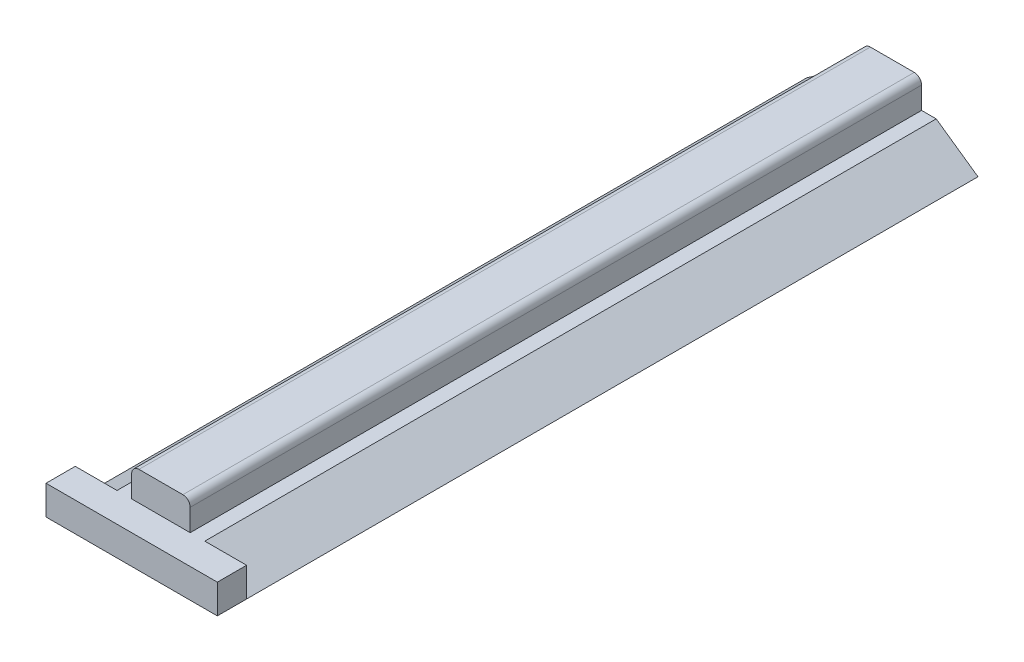
ISO-10303-21;
HEADER;
FILE_DESCRIPTION(('STEP AP214'),'2;1');
FILE_NAME('part.step','',(''),(''),'','','');
FILE_SCHEMA(('AUTOMOTIVE_DESIGN { 1 0 10303 214 1 1 1 1 }'));
ENDSEC;
DATA;
#1=APPLICATION_CONTEXT('core data for automotive mechanical design processes');
#2=APPLICATION_PROTOCOL_DEFINITION('international standard','automotive_design',2000,#1);
#3=PRODUCT_CONTEXT('',#1,'mechanical');
#4=PRODUCT('Part','Part','',(#3));
#5=PRODUCT_RELATED_PRODUCT_CATEGORY('part','',(#4));
#6=PRODUCT_DEFINITION_FORMATION('','',#4);
#7=PRODUCT_DEFINITION_CONTEXT('part definition',#1,'design');
#8=PRODUCT_DEFINITION('design','',#6,#7);
#9=PRODUCT_DEFINITION_SHAPE('','',#8);
#10=(LENGTH_UNIT() NAMED_UNIT(*) SI_UNIT(.MILLI.,.METRE.));
#11=(NAMED_UNIT(*) PLANE_ANGLE_UNIT() SI_UNIT($,.RADIAN.));
#12=(NAMED_UNIT(*) SI_UNIT($,.STERADIAN.) SOLID_ANGLE_UNIT());
#13=UNCERTAINTY_MEASURE_WITH_UNIT(LENGTH_MEASURE(1.E-05),#10,'distance_accuracy_value','');
#14=(GEOMETRIC_REPRESENTATION_CONTEXT(3) GLOBAL_UNCERTAINTY_ASSIGNED_CONTEXT((#13)) GLOBAL_UNIT_ASSIGNED_CONTEXT((#10,
#11,#12)) REPRESENTATION_CONTEXT('',''));
#15=CARTESIAN_POINT('',(0.,0.,0.));
#16=DIRECTION('',(0.,0.,1.));
#17=DIRECTION('',(1.,0.,0.));
#18=AXIS2_PLACEMENT_3D('',#15,#16,#17);
#19=CARTESIAN_POINT('',(3.,0.,25.));
#20=DIRECTION('',(0.,-1.,0.));
#21=DIRECTION('',(1.,0.,0.));
#22=AXIS2_PLACEMENT_3D('',#19,#20,#21);
#23=PLANE('',#22);
#24=DIRECTION('',(0.,0.,1.));
#25=VECTOR('',#24,1.);
#26=CARTESIAN_POINT('',(0.499999999999998,0.,0.));
#27=LINE('',#26,#25);
#28=CARTESIAN_POINT('',(0.5,0.,0.));
#29=VERTEX_POINT('',#28);
#30=CARTESIAN_POINT('',(0.500000000000001,0.,25.));
#31=VERTEX_POINT('',#30);
#32=EDGE_CURVE('E156',#29,#31,#27,.T.);
#33=ORIENTED_EDGE('',*,*,#32,.F.);
#34=DIRECTION('',(-1.,0.,0.));
#35=VECTOR('',#34,1.);
#36=CARTESIAN_POINT('',(3.,0.,0.));
#37=LINE('',#36,#35);
#38=CARTESIAN_POINT('',(0.,0.,0.));
#39=VERTEX_POINT('',#38);
#40=EDGE_CURVE('E211',#29,#39,#37,.T.);
#41=ORIENTED_EDGE('',*,*,#40,.T.);
#42=DIRECTION('',(0.,0.,-1.));
#43=VECTOR('',#42,1.);
#44=CARTESIAN_POINT('',(0.,0.,25.));
#45=LINE('',#44,#43);
#46=CARTESIAN_POINT('',(0.,0.,25.));
#47=VERTEX_POINT('',#46);
#48=EDGE_CURVE('E242',#47,#39,#45,.T.);
#49=ORIENTED_EDGE('',*,*,#48,.F.);
#50=DIRECTION('',(-1.,0.,0.));
#51=VECTOR('',#50,1.);
#52=CARTESIAN_POINT('',(-1.42814800674213,0.,25.));
#53=LINE('',#52,#51);
#54=CARTESIAN_POINT('',(-1.42814800674213,0.,25.));
#55=VERTEX_POINT('',#54);
#56=EDGE_CURVE('E192',#47,#55,#53,.T.);
#57=ORIENTED_EDGE('',*,*,#56,.T.);
#58=DIRECTION('',(0.,0.,-1.));
#59=VECTOR('',#58,1.);
#60=CARTESIAN_POINT('',(-1.42814800674213,0.,26.));
#61=LINE('',#60,#59);
#62=CARTESIAN_POINT('',(-1.42814800674213,0.,26.));
#63=VERTEX_POINT('',#62);
#64=EDGE_CURVE('E185',#63,#55,#61,.T.);
#65=ORIENTED_EDGE('',*,*,#64,.F.);
#66=DIRECTION('',(-1.,0.,0.));
#67=VECTOR('',#66,1.);
#68=CARTESIAN_POINT('',(-1.42814800674213,0.,26.));
#69=LINE('',#68,#67);
#70=CARTESIAN_POINT('',(4.42814800674213,0.,26.));
#71=VERTEX_POINT('',#70);
#72=EDGE_CURVE('E182',#71,#63,#69,.T.);
#73=ORIENTED_EDGE('',*,*,#72,.F.);
#74=DIRECTION('',(0.,0.,-1.));
#75=VECTOR('',#74,1.);
#76=CARTESIAN_POINT('',(4.42814800674213,0.,26.));
#77=LINE('',#76,#75);
#78=CARTESIAN_POINT('',(4.42814800674213,0.,25.));
#79=VERTEX_POINT('',#78);
#80=EDGE_CURVE('E199',#71,#79,#77,.T.);
#81=ORIENTED_EDGE('',*,*,#80,.T.);
#82=CARTESIAN_POINT('',(3.,0.,25.));
#83=VERTEX_POINT('',#82);
#84=EDGE_CURVE('E176',#79,#83,#53,.T.);
#85=ORIENTED_EDGE('',*,*,#84,.T.);
#86=DIRECTION('',(0.,0.,-1.));
#87=VECTOR('',#86,1.);
#88=CARTESIAN_POINT('',(3.,0.,25.));
#89=LINE('',#88,#87);
#90=CARTESIAN_POINT('',(3.,0.,0.));
#91=VERTEX_POINT('',#90);
#92=EDGE_CURVE('E221',#83,#91,#89,.T.);
#93=ORIENTED_EDGE('',*,*,#92,.T.);
#94=CARTESIAN_POINT('',(2.5,0.,0.));
#95=VERTEX_POINT('',#94);
#96=EDGE_CURVE('E150',#91,#95,#37,.T.);
#97=ORIENTED_EDGE('',*,*,#96,.T.);
#98=DIRECTION('',(0.,0.,-1.));
#99=VECTOR('',#98,1.);
#100=CARTESIAN_POINT('',(2.5,0.,0.));
#101=LINE('',#100,#99);
#102=CARTESIAN_POINT('',(2.5,0.,25.));
#103=VERTEX_POINT('',#102);
#104=EDGE_CURVE('E135',#103,#95,#101,.T.);
#105=ORIENTED_EDGE('',*,*,#104,.F.);
#106=DIRECTION('',(1.,0.,0.));
#107=VECTOR('',#106,1.);
#108=CARTESIAN_POINT('',(0.500000000000001,0.,25.));
#109=LINE('',#108,#107);
#110=EDGE_CURVE('E146',#31,#103,#109,.T.);
#111=ORIENTED_EDGE('',*,*,#110,.F.);
#112=EDGE_LOOP('',(#33,#41,#49,#57,#65,#73,#81,#85,#93,#97,#105,#111));
#113=FACE_BOUND('',#112,.T.);
#114=ADVANCED_FACE('F38',(#113),#23,.F.);
#115=CARTESIAN_POINT('',(0.,0.,25.));
#116=DIRECTION('',(0.573576436351041,-0.819152044288995,0.));
#117=DIRECTION('',(0.819152044288995,0.573576436351041,0.));
#118=AXIS2_PLACEMENT_3D('',#115,#116,#117);
#119=PLANE('',#118);
#120=DIRECTION('',(-0.819152044288995,-0.573576436351041,0.));
#121=VECTOR('',#120,1.);
#122=CARTESIAN_POINT('',(0.,0.,0.));
#123=LINE('',#122,#121);
#124=CARTESIAN_POINT('',(-1.42814800674213,-1.,0.));
#125=VERTEX_POINT('',#124);
#126=EDGE_CURVE('E224',#39,#125,#123,.T.);
#127=ORIENTED_EDGE('',*,*,#126,.T.);
#128=DIRECTION('',(0.,0.,-1.));
#129=VECTOR('',#128,1.);
#130=CARTESIAN_POINT('',(-1.42814800674213,-1.,25.));
#131=LINE('',#130,#129);
#132=CARTESIAN_POINT('',(-1.42814800674213,-1.,25.));
#133=VERTEX_POINT('',#132);
#134=EDGE_CURVE('E238',#133,#125,#131,.T.);
#135=ORIENTED_EDGE('',*,*,#134,.F.);
#136=DIRECTION('',(-0.819152044288995,-0.573576436351041,0.));
#137=VECTOR('',#136,1.);
#138=CARTESIAN_POINT('',(0.,0.,25.));
#139=LINE('',#138,#137);
#140=EDGE_CURVE('E212',#47,#133,#139,.T.);
#141=ORIENTED_EDGE('',*,*,#140,.F.);
#142=ORIENTED_EDGE('',*,*,#48,.T.);
#143=EDGE_LOOP('',(#127,#135,#141,#142));
#144=FACE_BOUND('',#143,.T.);
#145=ADVANCED_FACE('F289',(#144),#119,.F.);
#146=CARTESIAN_POINT('',(-1.42814800674213,-1.,25.));
#147=DIRECTION('',(0.,1.,0.));
#148=DIRECTION('',(-1.,0.,0.));
#149=AXIS2_PLACEMENT_3D('',#146,#147,#148);
#150=PLANE('',#149);
#151=DIRECTION('',(1.,0.,0.));
#152=VECTOR('',#151,1.);
#153=CARTESIAN_POINT('',(-1.42814800674213,-1.,0.));
#154=LINE('',#153,#152);
#155=CARTESIAN_POINT('',(4.42814800674213,-1.,0.));
#156=VERTEX_POINT('',#155);
#157=EDGE_CURVE('E227',#125,#156,#154,.T.);
#158=ORIENTED_EDGE('',*,*,#157,.T.);
#159=DIRECTION('',(0.,0.,-1.));
#160=VECTOR('',#159,1.);
#161=CARTESIAN_POINT('',(4.42814800674213,-1.,25.));
#162=LINE('',#161,#160);
#163=CARTESIAN_POINT('',(4.42814800674213,-1.,25.));
#164=VERTEX_POINT('',#163);
#165=EDGE_CURVE('E234',#164,#156,#162,.T.);
#166=ORIENTED_EDGE('',*,*,#165,.F.);
#167=DIRECTION('',(0.,0.,-1.));
#168=VECTOR('',#167,1.);
#169=CARTESIAN_POINT('',(4.42814800674213,-1.,26.));
#170=LINE('',#169,#168);
#171=CARTESIAN_POINT('',(4.42814800674213,-1.,26.));
#172=VERTEX_POINT('',#171);
#173=EDGE_CURVE('E203',#172,#164,#170,.T.);
#174=ORIENTED_EDGE('',*,*,#173,.F.);
#175=DIRECTION('',(1.,0.,0.));
#176=VECTOR('',#175,1.);
#177=CARTESIAN_POINT('',(-1.42814800674213,-1.,26.));
#178=LINE('',#177,#176);
#179=CARTESIAN_POINT('',(-1.42814800674213,-1.,26.));
#180=VERTEX_POINT('',#179);
#181=EDGE_CURVE('E175',#180,#172,#178,.T.);
#182=ORIENTED_EDGE('',*,*,#181,.F.);
#183=DIRECTION('',(0.,0.,-1.));
#184=VECTOR('',#183,1.);
#185=CARTESIAN_POINT('',(-1.42814800674213,-1.,26.));
#186=LINE('',#185,#184);
#187=EDGE_CURVE('E207',#180,#133,#186,.T.);
#188=ORIENTED_EDGE('',*,*,#187,.T.);
#189=ORIENTED_EDGE('',*,*,#134,.T.);
#190=EDGE_LOOP('',(#158,#166,#174,#182,#188,#189));
#191=FACE_BOUND('',#190,.T.);
#192=ADVANCED_FACE('F295',(#191),#150,.F.);
#193=CARTESIAN_POINT('',(4.42814800674213,-1.,25.));
#194=DIRECTION('',(-0.573576436351041,-0.819152044288995,0.));
#195=DIRECTION('',(0.819152044288995,-0.573576436351041,0.));
#196=AXIS2_PLACEMENT_3D('',#193,#194,#195);
#197=PLANE('',#196);
#198=DIRECTION('',(-0.819152044288995,0.573576436351041,0.));
#199=VECTOR('',#198,1.);
#200=CARTESIAN_POINT('',(4.42814800674213,-1.,0.));
#201=LINE('',#200,#199);
#202=EDGE_CURVE('E217',#156,#91,#201,.T.);
#203=ORIENTED_EDGE('',*,*,#202,.T.);
#204=ORIENTED_EDGE('',*,*,#92,.F.);
#205=DIRECTION('',(-0.819152044288995,0.573576436351041,0.));
#206=VECTOR('',#205,1.);
#207=CARTESIAN_POINT('',(4.42814800674213,-1.,25.));
#208=LINE('',#207,#206);
#209=EDGE_CURVE('E216',#164,#83,#208,.T.);
#210=ORIENTED_EDGE('',*,*,#209,.F.);
#211=ORIENTED_EDGE('',*,*,#165,.T.);
#212=EDGE_LOOP('',(#203,#204,#210,#211));
#213=FACE_BOUND('',#212,.T.);
#214=ADVANCED_FACE('F314',(#213),#197,.F.);
#215=CARTESIAN_POINT('',(0.,0.,0.));
#216=DIRECTION('',(0.,0.,1.));
#217=DIRECTION('',(1.,0.,0.));
#218=AXIS2_PLACEMENT_3D('',#215,#216,#217);
#219=PLANE('',#218);
#220=DIRECTION('',(-1.,0.,0.));
#221=VECTOR('',#220,1.);
#222=CARTESIAN_POINT('',(0.499999999999998,1.,0.));
#223=LINE('',#222,#221);
#224=CARTESIAN_POINT('',(2.25,1.,0.));
#225=VERTEX_POINT('',#224);
#226=CARTESIAN_POINT('',(0.749999999999998,1.,0.));
#227=VERTEX_POINT('',#226);
#228=EDGE_CURVE('E165',#225,#227,#223,.T.);
#229=ORIENTED_EDGE('',*,*,#228,.F.);
#230=CARTESIAN_POINT('',(2.25,0.75,0.));
#231=DIRECTION('',(0.,0.,1.));
#232=DIRECTION('',(1.,0.,0.));
#233=AXIS2_PLACEMENT_3D('',#230,#231,#232);
#234=CIRCLE('',#233,0.25);
#235=CARTESIAN_POINT('',(2.5,0.75,0.));
#236=VERTEX_POINT('',#235);
#237=EDGE_CURVE('E257',#225,#236,#234,.F.);
#238=ORIENTED_EDGE('',*,*,#237,.T.);
#239=DIRECTION('',(0.,-1.,0.));
#240=VECTOR('',#239,1.);
#241=CARTESIAN_POINT('',(2.5,1.,0.));
#242=LINE('',#241,#240);
#243=EDGE_CURVE('E140',#236,#95,#242,.T.);
#244=ORIENTED_EDGE('',*,*,#243,.T.);
#245=ORIENTED_EDGE('',*,*,#96,.F.);
#246=ORIENTED_EDGE('',*,*,#202,.F.);
#247=ORIENTED_EDGE('',*,*,#157,.F.);
#248=ORIENTED_EDGE('',*,*,#126,.F.);
#249=ORIENTED_EDGE('',*,*,#40,.F.);
#250=DIRECTION('',(0.,-1.,0.));
#251=VECTOR('',#250,1.);
#252=CARTESIAN_POINT('',(0.499999999999998,1.,0.));
#253=LINE('',#252,#251);
#254=CARTESIAN_POINT('',(0.499999999999998,0.75,0.));
#255=VERTEX_POINT('',#254);
#256=EDGE_CURVE('E162',#255,#29,#253,.T.);
#257=ORIENTED_EDGE('',*,*,#256,.F.);
#258=CARTESIAN_POINT('',(0.749999999999998,0.75,0.));
#259=DIRECTION('',(0.,0.,1.));
#260=DIRECTION('',(1.,0.,0.));
#261=AXIS2_PLACEMENT_3D('',#258,#259,#260);
#262=CIRCLE('',#261,0.25);
#263=EDGE_CURVE('E254',#255,#227,#262,.F.);
#264=ORIENTED_EDGE('',*,*,#263,.T.);
#265=EDGE_LOOP('',(#229,#238,#244,#245,#246,#247,#248,#249,#257,#264));
#266=FACE_BOUND('',#265,.T.);
#267=ADVANCED_FACE('F276',(#266),#219,.F.);
#268=CARTESIAN_POINT('',(0.,0.,25.));
#269=DIRECTION('',(0.,0.,-1.));
#270=DIRECTION('',(-1.,0.,0.));
#271=AXIS2_PLACEMENT_3D('',#268,#269,#270);
#272=PLANE('',#271);
#273=ORIENTED_EDGE('',*,*,#56,.F.);
#274=ORIENTED_EDGE('',*,*,#140,.T.);
#275=DIRECTION('',(0.,-1.,0.));
#276=VECTOR('',#275,1.);
#277=CARTESIAN_POINT('',(-1.42814800674213,-1.,25.));
#278=LINE('',#277,#276);
#279=EDGE_CURVE('E170',#55,#133,#278,.T.);
#280=ORIENTED_EDGE('',*,*,#279,.F.);
#281=EDGE_LOOP('',(#273,#274,#280));
#282=FACE_BOUND('',#281,.T.);
#283=ADVANCED_FACE('F292',(#282),#272,.T.);
#284=CARTESIAN_POINT('',(-1.42814800674213,-1.,26.));
#285=DIRECTION('',(1.,0.,0.));
#286=DIRECTION('',(0.,0.,-1.));
#287=AXIS2_PLACEMENT_3D('',#284,#285,#286);
#288=PLANE('',#287);
#289=ORIENTED_EDGE('',*,*,#279,.T.);
#290=ORIENTED_EDGE('',*,*,#187,.F.);
#291=DIRECTION('',(0.,-1.,0.));
#292=VECTOR('',#291,1.);
#293=CARTESIAN_POINT('',(-1.42814800674213,-1.,26.));
#294=LINE('',#293,#292);
#295=EDGE_CURVE('E171',#63,#180,#294,.T.);
#296=ORIENTED_EDGE('',*,*,#295,.F.);
#297=ORIENTED_EDGE('',*,*,#64,.T.);
#298=EDGE_LOOP('',(#289,#290,#296,#297));
#299=FACE_BOUND('',#298,.T.);
#300=ADVANCED_FACE('F299',(#299),#288,.F.);
#301=CARTESIAN_POINT('',(4.42814800674213,-1.,26.));
#302=DIRECTION('',(-1.,0.,0.));
#303=DIRECTION('',(0.,0.,1.));
#304=AXIS2_PLACEMENT_3D('',#301,#302,#303);
#305=PLANE('',#304);
#306=DIRECTION('',(0.,1.,0.));
#307=VECTOR('',#306,1.);
#308=CARTESIAN_POINT('',(4.42814800674213,-1.,25.));
#309=LINE('',#308,#307);
#310=EDGE_CURVE('E189',#164,#79,#309,.T.);
#311=ORIENTED_EDGE('',*,*,#310,.T.);
#312=ORIENTED_EDGE('',*,*,#80,.F.);
#313=DIRECTION('',(0.,1.,0.));
#314=VECTOR('',#313,1.);
#315=CARTESIAN_POINT('',(4.42814800674213,-1.,26.));
#316=LINE('',#315,#314);
#317=EDGE_CURVE('E179',#172,#71,#316,.T.);
#318=ORIENTED_EDGE('',*,*,#317,.F.);
#319=ORIENTED_EDGE('',*,*,#173,.T.);
#320=EDGE_LOOP('',(#311,#312,#318,#319));
#321=FACE_BOUND('',#320,.T.);
#322=ADVANCED_FACE('F308',(#321),#305,.F.);
#323=CARTESIAN_POINT('',(0.,0.,26.));
#324=DIRECTION('',(0.,0.,-1.));
#325=DIRECTION('',(-1.,0.,0.));
#326=AXIS2_PLACEMENT_3D('',#323,#324,#325);
#327=PLANE('',#326);
#328=ORIENTED_EDGE('',*,*,#295,.T.);
#329=ORIENTED_EDGE('',*,*,#181,.T.);
#330=ORIENTED_EDGE('',*,*,#317,.T.);
#331=ORIENTED_EDGE('',*,*,#72,.T.);
#332=EDGE_LOOP('',(#328,#329,#330,#331));
#333=FACE_BOUND('',#332,.T.);
#334=ADVANCED_FACE('F305',(#333),#327,.F.);
#335=ORIENTED_EDGE('',*,*,#310,.F.);
#336=ORIENTED_EDGE('',*,*,#209,.T.);
#337=ORIENTED_EDGE('',*,*,#84,.F.);
#338=EDGE_LOOP('',(#335,#336,#337));
#339=FACE_BOUND('',#338,.T.);
#340=ADVANCED_FACE('F311',(#339),#272,.T.);
#341=CARTESIAN_POINT('',(0.499999999999998,1.,0.));
#342=DIRECTION('',(1.,0.,0.));
#343=DIRECTION('',(0.,0.,-1.));
#344=AXIS2_PLACEMENT_3D('',#341,#342,#343);
#345=PLANE('',#344);
#346=DIRECTION('',(0.,-1.,0.));
#347=VECTOR('',#346,1.);
#348=CARTESIAN_POINT('',(0.500000000000001,1.,25.));
#349=LINE('',#348,#347);
#350=CARTESIAN_POINT('',(0.500000000000001,0.75,25.));
#351=VERTEX_POINT('',#350);
#352=EDGE_CURVE('E139',#351,#31,#349,.T.);
#353=ORIENTED_EDGE('',*,*,#352,.F.);
#354=DIRECTION('',(0.,0.,1.));
#355=VECTOR('',#354,1.);
#356=CARTESIAN_POINT('',(0.499999999999998,0.75,0.));
#357=LINE('',#356,#355);
#358=EDGE_CURVE('E11',#351,#255,#357,.F.);
#359=ORIENTED_EDGE('',*,*,#358,.T.);
#360=ORIENTED_EDGE('',*,*,#256,.T.);
#361=ORIENTED_EDGE('',*,*,#32,.T.);
#362=EDGE_LOOP('',(#353,#359,#360,#361));
#363=FACE_BOUND('',#362,.T.);
#364=ADVANCED_FACE('F344',(#363),#345,.F.);
#365=CARTESIAN_POINT('',(0.500000000000001,1.,25.));
#366=DIRECTION('',(0.,0.,-1.));
#367=DIRECTION('',(-1.,0.,0.));
#368=AXIS2_PLACEMENT_3D('',#365,#366,#367);
#369=PLANE('',#368);
#370=DIRECTION('',(0.,-1.,0.));
#371=VECTOR('',#370,1.);
#372=CARTESIAN_POINT('',(2.5,1.,25.));
#373=LINE('',#372,#371);
#374=CARTESIAN_POINT('',(2.5,0.75,25.));
#375=VERTEX_POINT('',#374);
#376=EDGE_CURVE('E132',#375,#103,#373,.T.);
#377=ORIENTED_EDGE('',*,*,#376,.F.);
#378=CARTESIAN_POINT('',(2.25,0.75,25.));
#379=DIRECTION('',(0.,0.,-1.));
#380=DIRECTION('',(-1.,0.,0.));
#381=AXIS2_PLACEMENT_3D('',#378,#379,#380);
#382=CIRCLE('',#381,0.25);
#383=CARTESIAN_POINT('',(2.25,1.,25.));
#384=VERTEX_POINT('',#383);
#385=EDGE_CURVE('E47',#375,#384,#382,.F.);
#386=ORIENTED_EDGE('',*,*,#385,.T.);
#387=DIRECTION('',(1.,0.,0.));
#388=VECTOR('',#387,1.);
#389=CARTESIAN_POINT('',(0.500000000000001,1.,25.));
#390=LINE('',#389,#388);
#391=CARTESIAN_POINT('',(0.750000000000001,1.,25.));
#392=VERTEX_POINT('',#391);
#393=EDGE_CURVE('E152',#392,#384,#390,.T.);
#394=ORIENTED_EDGE('',*,*,#393,.F.);
#395=CARTESIAN_POINT('',(0.750000000000001,0.75,25.));
#396=DIRECTION('',(0.,0.,-1.));
#397=DIRECTION('',(-1.,0.,0.));
#398=AXIS2_PLACEMENT_3D('',#395,#396,#397);
#399=CIRCLE('',#398,0.25);
#400=EDGE_CURVE('E54',#392,#351,#399,.F.);
#401=ORIENTED_EDGE('',*,*,#400,.T.);
#402=ORIENTED_EDGE('',*,*,#352,.T.);
#403=ORIENTED_EDGE('',*,*,#110,.T.);
#404=EDGE_LOOP('',(#377,#386,#394,#401,#402,#403));
#405=FACE_BOUND('',#404,.T.);
#406=ADVANCED_FACE('F154',(#405),#369,.F.);
#407=CARTESIAN_POINT('',(2.5,1.,0.));
#408=DIRECTION('',(-1.,0.,0.));
#409=DIRECTION('',(0.,0.,1.));
#410=AXIS2_PLACEMENT_3D('',#407,#408,#409);
#411=PLANE('',#410);
#412=ORIENTED_EDGE('',*,*,#243,.F.);
#413=DIRECTION('',(0.,0.,-1.));
#414=VECTOR('',#413,1.);
#415=CARTESIAN_POINT('',(2.5,0.75,25.));
#416=LINE('',#415,#414);
#417=EDGE_CURVE('E62',#236,#375,#416,.F.);
#418=ORIENTED_EDGE('',*,*,#417,.T.);
#419=ORIENTED_EDGE('',*,*,#376,.T.);
#420=ORIENTED_EDGE('',*,*,#104,.T.);
#421=EDGE_LOOP('',(#412,#418,#419,#420));
#422=FACE_BOUND('',#421,.T.);
#423=ADVANCED_FACE('F134',(#422),#411,.F.);
#424=CARTESIAN_POINT('',(0.,1.,0.));
#425=DIRECTION('',(0.,1.,0.));
#426=DIRECTION('',(-1.,0.,0.));
#427=AXIS2_PLACEMENT_3D('',#424,#425,#426);
#428=PLANE('',#427);
#429=ORIENTED_EDGE('',*,*,#393,.T.);
#430=DIRECTION('',(0.,0.,-1.));
#431=VECTOR('',#430,1.);
#432=CARTESIAN_POINT('',(2.25,1.,0.));
#433=LINE('',#432,#431);
#434=EDGE_CURVE('E250',#384,#225,#433,.T.);
#435=ORIENTED_EDGE('',*,*,#434,.T.);
#436=ORIENTED_EDGE('',*,*,#228,.T.);
#437=DIRECTION('',(0.,0.,1.));
#438=VECTOR('',#437,1.);
#439=CARTESIAN_POINT('',(0.750000000000001,1.,25.));
#440=LINE('',#439,#438);
#441=EDGE_CURVE('E246',#227,#392,#440,.T.);
#442=ORIENTED_EDGE('',*,*,#441,.T.);
#443=EDGE_LOOP('',(#429,#435,#436,#442));
#444=FACE_BOUND('',#443,.T.);
#445=ADVANCED_FACE('F268',(#444),#428,.T.);
#446=CARTESIAN_POINT('',(2.25,0.75,0.));
#447=DIRECTION('',(0.,0.,1.));
#448=DIRECTION('',(1.,0.,0.));
#449=AXIS2_PLACEMENT_3D('',#446,#447,#448);
#450=CYLINDRICAL_SURFACE('',#449,0.25);
#451=ORIENTED_EDGE('',*,*,#385,.F.);
#452=ORIENTED_EDGE('',*,*,#417,.F.);
#453=ORIENTED_EDGE('',*,*,#237,.F.);
#454=ORIENTED_EDGE('',*,*,#434,.F.);
#455=EDGE_LOOP('',(#451,#452,#453,#454));
#456=FACE_BOUND('',#455,.T.);
#457=ADVANCED_FACE('F274',(#456),#450,.T.);
#458=CARTESIAN_POINT('',(0.749999999999998,0.75,0.));
#459=DIRECTION('',(0.,0.,-1.));
#460=DIRECTION('',(-1.,0.,0.));
#461=AXIS2_PLACEMENT_3D('',#458,#459,#460);
#462=CYLINDRICAL_SURFACE('',#461,0.25);
#463=ORIENTED_EDGE('',*,*,#263,.F.);
#464=ORIENTED_EDGE('',*,*,#358,.F.);
#465=ORIENTED_EDGE('',*,*,#400,.F.);
#466=ORIENTED_EDGE('',*,*,#441,.F.);
#467=EDGE_LOOP('',(#463,#464,#465,#466));
#468=FACE_BOUND('',#467,.T.);
#469=ADVANCED_FACE('F40',(#468),#462,.T.);
#470=CLOSED_SHELL('',(#114,#145,#192,#214,#267,#283,#300,#322,#334,#340,#364,#406,#423,#445,
#457,#469));
#471=MANIFOLD_SOLID_BREP('B2',#470);
#472=ADVANCED_BREP_SHAPE_REPRESENTATION('',(#18,#471),#14);
#473=SHAPE_DEFINITION_REPRESENTATION(#9,#472);
ENDSEC;
END-ISO-10303-21;
